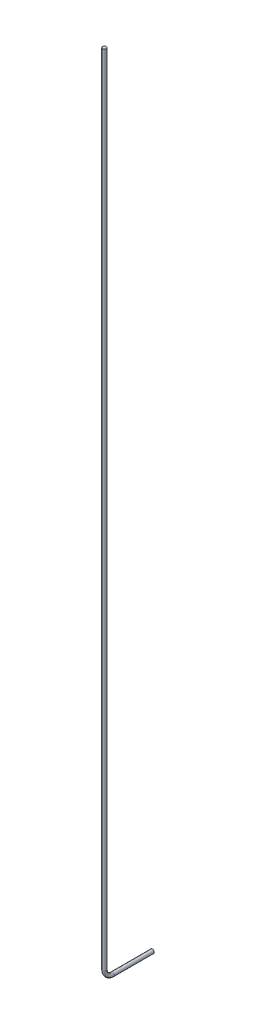
ISO-10303-21;
HEADER;
FILE_DESCRIPTION(('STEP AP214'),'2;1');
FILE_NAME('part.step','',(''),(''),'','','');
FILE_SCHEMA(('AUTOMOTIVE_DESIGN { 1 0 10303 214 1 1 1 1 }'));
ENDSEC;
DATA;
#1=APPLICATION_CONTEXT('core data for automotive mechanical design processes');
#2=APPLICATION_PROTOCOL_DEFINITION('international standard','automotive_design',2000,#1);
#3=PRODUCT_CONTEXT('',#1,'mechanical');
#4=PRODUCT('Part','Part','',(#3));
#5=PRODUCT_RELATED_PRODUCT_CATEGORY('part','',(#4));
#6=PRODUCT_DEFINITION_FORMATION('','',#4);
#7=PRODUCT_DEFINITION_CONTEXT('part definition',#1,'design');
#8=PRODUCT_DEFINITION('design','',#6,#7);
#9=PRODUCT_DEFINITION_SHAPE('','',#8);
#10=(LENGTH_UNIT() NAMED_UNIT(*) SI_UNIT(.MILLI.,.METRE.));
#11=(NAMED_UNIT(*) PLANE_ANGLE_UNIT() SI_UNIT($,.RADIAN.));
#12=(NAMED_UNIT(*) SI_UNIT($,.STERADIAN.) SOLID_ANGLE_UNIT());
#13=UNCERTAINTY_MEASURE_WITH_UNIT(LENGTH_MEASURE(1.E-05),#10,'distance_accuracy_value','');
#14=(GEOMETRIC_REPRESENTATION_CONTEXT(3) GLOBAL_UNCERTAINTY_ASSIGNED_CONTEXT((#13)) GLOBAL_UNIT_ASSIGNED_CONTEXT((#10,
#11,#12)) REPRESENTATION_CONTEXT('',''));
#15=CARTESIAN_POINT('',(0.,0.,0.));
#16=DIRECTION('',(0.,0.,1.));
#17=DIRECTION('',(1.,0.,0.));
#18=AXIS2_PLACEMENT_3D('',#15,#16,#17);
#19=CARTESIAN_POINT('',(0.,0.,20.));
#20=DIRECTION('',(0.,0.,-1.));
#21=DIRECTION('',(-1.,0.,0.));
#22=AXIS2_PLACEMENT_3D('',#19,#20,#21);
#23=CYLINDRICAL_SURFACE('',#22,1.2);
#24=CARTESIAN_POINT('',(0.,0.,0.));
#25=DIRECTION('',(0.,0.,1.));
#26=DIRECTION('',(1.,0.,0.));
#27=AXIS2_PLACEMENT_3D('',#24,#25,#26);
#28=CIRCLE('',#27,1.2);
#29=CARTESIAN_POINT('',(1.2,0.,0.));
#30=VERTEX_POINT('',#29);
#31=EDGE_CURVE('E10',#30,#30,#28,.T.);
#32=ORIENTED_EDGE('',*,*,#31,.T.);
#33=EDGE_LOOP('',(#32));
#34=FACE_BOUND('',#33,.T.);
#35=CARTESIAN_POINT('',(0.,0.,25.));
#36=DIRECTION('',(0.,0.,1.));
#37=DIRECTION('',(1.,0.,0.));
#38=AXIS2_PLACEMENT_3D('',#35,#36,#37);
#39=CIRCLE('',#38,1.2);
#40=CARTESIAN_POINT('',(0.,-1.19999999999984,25.));
#41=VERTEX_POINT('',#40);
#42=EDGE_CURVE('E56',#41,#41,#39,.T.);
#43=ORIENTED_EDGE('',*,*,#42,.F.);
#44=EDGE_LOOP('',(#43));
#45=FACE_BOUND('',#44,.T.);
#46=ADVANCED_FACE('F39',(#34,#45),#23,.T.);
#47=CARTESIAN_POINT('',(0.,0.,0.));
#48=DIRECTION('',(0.,0.,1.));
#49=DIRECTION('',(1.,0.,0.));
#50=AXIS2_PLACEMENT_3D('',#47,#48,#49);
#51=PLANE('',#50);
#52=ORIENTED_EDGE('',*,*,#31,.F.);
#53=EDGE_LOOP('',(#52));
#54=FACE_BOUND('',#53,.T.);
#55=ADVANCED_FACE('F66',(#54),#51,.F.);
#56=CARTESIAN_POINT('',(0.,505.,30.));
#57=DIRECTION('',(0.,1.,0.));
#58=DIRECTION('',(1.,0.,0.));
#59=AXIS2_PLACEMENT_3D('',#56,#57,#58);
#60=PLANE('',#59);
#61=CARTESIAN_POINT('',(0.,505.,30.));
#62=DIRECTION('',(0.,1.,0.));
#63=DIRECTION('',(1.,0.,0.));
#64=AXIS2_PLACEMENT_3D('',#61,#62,#63);
#65=CIRCLE('',#64,1.2);
#66=CARTESIAN_POINT('',(1.2,505.,30.));
#67=VERTEX_POINT('',#66);
#68=EDGE_CURVE('E46',#67,#67,#65,.T.);
#69=ORIENTED_EDGE('',*,*,#68,.T.);
#70=EDGE_LOOP('',(#69));
#71=FACE_BOUND('',#70,.T.);
#72=ADVANCED_FACE('F70',(#71),#60,.T.);
#73=CARTESIAN_POINT('',(0.,5.,25.));
#74=DIRECTION('',(-1.,0.,0.));
#75=DIRECTION('',(0.,0.,1.));
#76=AXIS2_PLACEMENT_3D('',#73,#74,#75);
#77=TOROIDAL_SURFACE('',#76,4.99999999999984,1.2);
#78=CARTESIAN_POINT('',(0.,5.,30.));
#79=DIRECTION('',(0.,1.,0.));
#80=DIRECTION('',(1.,0.,0.));
#81=AXIS2_PLACEMENT_3D('',#78,#79,#80);
#82=CIRCLE('',#81,1.2);
#83=CARTESIAN_POINT('',(0.,5.,31.1999999999998));
#84=VERTEX_POINT('',#83);
#85=EDGE_CURVE('E51',#84,#84,#82,.T.);
#86=CARTESIAN_POINT('',(0.,5.,25.));
#87=DIRECTION('',(-1.,0.,0.));
#88=DIRECTION('',(0.,0.,1.));
#89=AXIS2_PLACEMENT_3D('',#86,#87,#88);
#90=CIRCLE('',#89,6.19999999999983);
#91=EDGE_CURVE('',#41,#84,#90,.T.);
#92=ORIENTED_EDGE('',*,*,#42,.T.);
#93=ORIENTED_EDGE('',*,*,#85,.F.);
#94=ORIENTED_EDGE('',*,*,#91,.T.);
#95=ORIENTED_EDGE('',*,*,#91,.F.);
#96=EDGE_LOOP('',(#92,#94,#93,#95));
#97=FACE_BOUND('',#96,.T.);
#98=ADVANCED_FACE('F63',(#97),#77,.T.);
#99=CARTESIAN_POINT('',(0.,5.,30.));
#100=DIRECTION('',(0.,1.,0.));
#101=DIRECTION('',(0.,0.,1.));
#102=AXIS2_PLACEMENT_3D('',#99,#100,#101);
#103=CYLINDRICAL_SURFACE('',#102,1.2);
#104=ORIENTED_EDGE('',*,*,#68,.F.);
#105=EDGE_LOOP('',(#104));
#106=FACE_BOUND('',#105,.T.);
#107=ORIENTED_EDGE('',*,*,#85,.T.);
#108=EDGE_LOOP('',(#107));
#109=FACE_BOUND('',#108,.T.);
#110=ADVANCED_FACE('F72',(#106,#109),#103,.T.);
#111=CLOSED_SHELL('',(#46,#55,#72,#98,#110));
#112=MANIFOLD_SOLID_BREP('B2',#111);
#113=ADVANCED_BREP_SHAPE_REPRESENTATION('',(#18,#112),#14);
#114=SHAPE_DEFINITION_REPRESENTATION(#9,#113);
ENDSEC;
END-ISO-10303-21;
